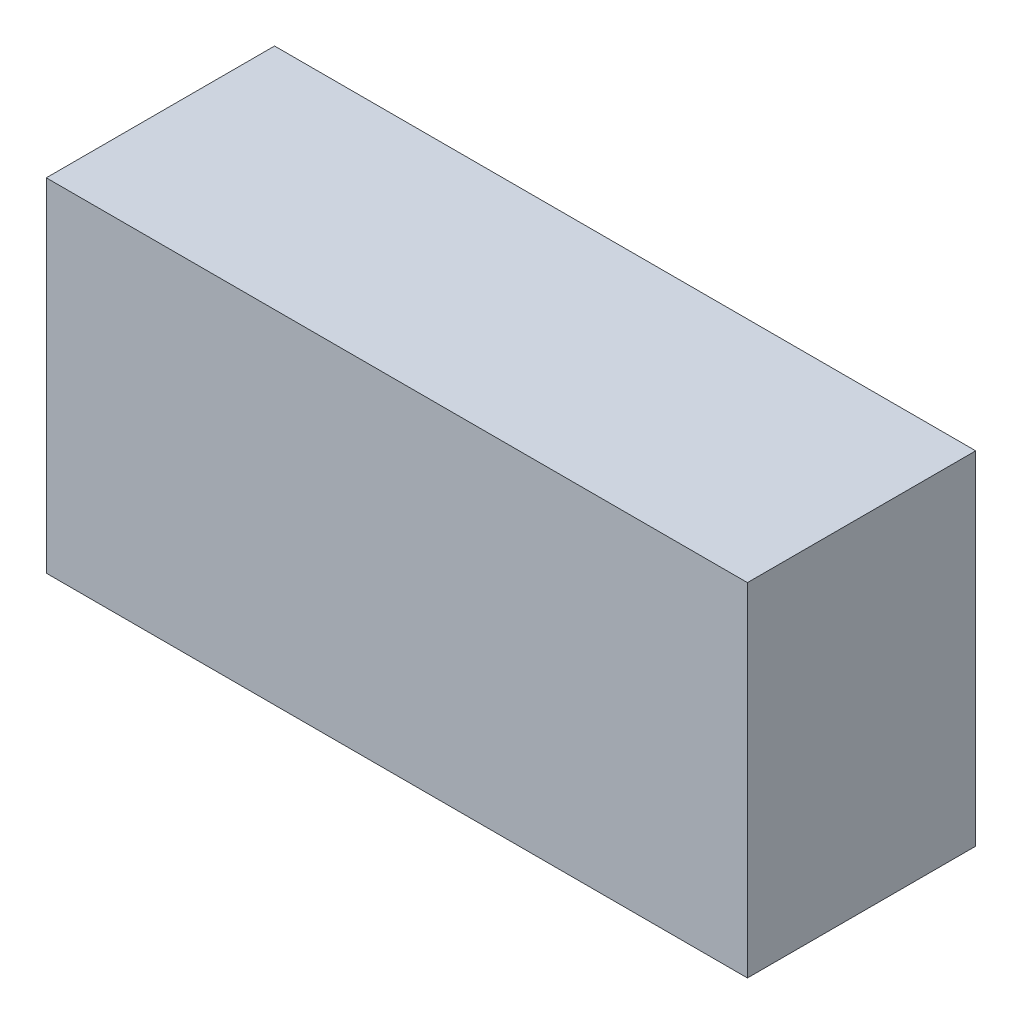
ISO-10303-21;
HEADER;
FILE_DESCRIPTION(('STEP AP214'),'2;1');
FILE_NAME('part.step','',(''),(''),'','','');
FILE_SCHEMA(('AUTOMOTIVE_DESIGN { 1 0 10303 214 1 1 1 1 }'));
ENDSEC;
DATA;
#1=APPLICATION_CONTEXT('core data for automotive mechanical design processes');
#2=APPLICATION_PROTOCOL_DEFINITION('international standard','automotive_design',2000,#1);
#3=PRODUCT_CONTEXT('',#1,'mechanical');
#4=PRODUCT('Part','Part','',(#3));
#5=PRODUCT_RELATED_PRODUCT_CATEGORY('part','',(#4));
#6=PRODUCT_DEFINITION_FORMATION('','',#4);
#7=PRODUCT_DEFINITION_CONTEXT('part definition',#1,'design');
#8=PRODUCT_DEFINITION('design','',#6,#7);
#9=PRODUCT_DEFINITION_SHAPE('','',#8);
#10=(LENGTH_UNIT() NAMED_UNIT(*) SI_UNIT(.MILLI.,.METRE.));
#11=(NAMED_UNIT(*) PLANE_ANGLE_UNIT() SI_UNIT($,.RADIAN.));
#12=(NAMED_UNIT(*) SI_UNIT($,.STERADIAN.) SOLID_ANGLE_UNIT());
#13=UNCERTAINTY_MEASURE_WITH_UNIT(LENGTH_MEASURE(1.E-05),#10,'distance_accuracy_value','');
#14=(GEOMETRIC_REPRESENTATION_CONTEXT(3) GLOBAL_UNCERTAINTY_ASSIGNED_CONTEXT((#13)) GLOBAL_UNIT_ASSIGNED_CONTEXT((#10,
#11,#12)) REPRESENTATION_CONTEXT('',''));
#15=CARTESIAN_POINT('',(0.,0.,0.));
#16=DIRECTION('',(0.,0.,1.));
#17=DIRECTION('',(1.,0.,0.));
#18=AXIS2_PLACEMENT_3D('',#15,#16,#17);
#19=CARTESIAN_POINT('',(-21.5,21.,14.));
#20=DIRECTION('',(1.,0.,0.));
#21=DIRECTION('',(0.,1.,0.));
#22=AXIS2_PLACEMENT_3D('',#19,#20,#21);
#23=PLANE('',#22);
#24=DIRECTION('',(0.,-1.,0.));
#25=VECTOR('',#24,1.);
#26=CARTESIAN_POINT('',(-21.5,21.,0.));
#27=LINE('',#26,#25);
#28=CARTESIAN_POINT('',(-21.5,21.,0.));
#29=VERTEX_POINT('',#28);
#30=CARTESIAN_POINT('',(-21.5,0.,0.));
#31=VERTEX_POINT('',#30);
#32=EDGE_CURVE('E96',#29,#31,#27,.T.);
#33=ORIENTED_EDGE('',*,*,#32,.T.);
#34=DIRECTION('',(0.,0.,-1.));
#35=VECTOR('',#34,1.);
#36=CARTESIAN_POINT('',(-21.5,0.,14.));
#37=LINE('',#36,#35);
#38=CARTESIAN_POINT('',(-21.5,0.,14.));
#39=VERTEX_POINT('',#38);
#40=EDGE_CURVE('E11',#39,#31,#37,.T.);
#41=ORIENTED_EDGE('',*,*,#40,.F.);
#42=DIRECTION('',(0.,-1.,0.));
#43=VECTOR('',#42,1.);
#44=CARTESIAN_POINT('',(-21.5,21.,14.));
#45=LINE('',#44,#43);
#46=CARTESIAN_POINT('',(-21.5,21.,14.));
#47=VERTEX_POINT('',#46);
#48=EDGE_CURVE('E84',#47,#39,#45,.T.);
#49=ORIENTED_EDGE('',*,*,#48,.F.);
#50=DIRECTION('',(0.,0.,-1.));
#51=VECTOR('',#50,1.);
#52=CARTESIAN_POINT('',(-21.5,21.,14.));
#53=LINE('',#52,#51);
#54=EDGE_CURVE('E92',#47,#29,#53,.T.);
#55=ORIENTED_EDGE('',*,*,#54,.T.);
#56=EDGE_LOOP('',(#33,#41,#49,#55));
#57=FACE_BOUND('',#56,.T.);
#58=ADVANCED_FACE('F33',(#57),#23,.F.);
#59=CARTESIAN_POINT('',(-21.5,0.,14.));
#60=DIRECTION('',(0.,1.,0.));
#61=DIRECTION('',(0.,0.,1.));
#62=AXIS2_PLACEMENT_3D('',#59,#60,#61);
#63=PLANE('',#62);
#64=DIRECTION('',(1.,0.,0.));
#65=VECTOR('',#64,1.);
#66=CARTESIAN_POINT('',(-21.5,0.,0.));
#67=LINE('',#66,#65);
#68=CARTESIAN_POINT('',(21.5,0.,0.));
#69=VERTEX_POINT('',#68);
#70=EDGE_CURVE('E88',#31,#69,#67,.T.);
#71=ORIENTED_EDGE('',*,*,#70,.T.);
#72=DIRECTION('',(0.,0.,-1.));
#73=VECTOR('',#72,1.);
#74=CARTESIAN_POINT('',(21.5,0.,14.));
#75=LINE('',#74,#73);
#76=CARTESIAN_POINT('',(21.5,0.,14.));
#77=VERTEX_POINT('',#76);
#78=EDGE_CURVE('E41',#77,#69,#75,.T.);
#79=ORIENTED_EDGE('',*,*,#78,.F.);
#80=DIRECTION('',(1.,0.,0.));
#81=VECTOR('',#80,1.);
#82=CARTESIAN_POINT('',(-21.5,0.,14.));
#83=LINE('',#82,#81);
#84=EDGE_CURVE('E79',#39,#77,#83,.T.);
#85=ORIENTED_EDGE('',*,*,#84,.F.);
#86=ORIENTED_EDGE('',*,*,#40,.T.);
#87=EDGE_LOOP('',(#71,#79,#85,#86));
#88=FACE_BOUND('',#87,.T.);
#89=ADVANCED_FACE('F87',(#88),#63,.F.);
#90=CARTESIAN_POINT('',(21.5,21.,14.));
#91=DIRECTION('',(-1.,0.,0.));
#92=DIRECTION('',(0.,-1.,0.));
#93=AXIS2_PLACEMENT_3D('',#90,#91,#92);
#94=PLANE('',#93);
#95=DIRECTION('',(0.,1.,0.));
#96=VECTOR('',#95,1.);
#97=CARTESIAN_POINT('',(21.5,21.,0.));
#98=LINE('',#97,#96);
#99=CARTESIAN_POINT('',(21.5,21.,0.));
#100=VERTEX_POINT('',#99);
#101=EDGE_CURVE('E66',#69,#100,#98,.T.);
#102=ORIENTED_EDGE('',*,*,#101,.T.);
#103=DIRECTION('',(0.,0.,-1.));
#104=VECTOR('',#103,1.);
#105=CARTESIAN_POINT('',(21.5,21.,14.));
#106=LINE('',#105,#104);
#107=CARTESIAN_POINT('',(21.5,21.,14.));
#108=VERTEX_POINT('',#107);
#109=EDGE_CURVE('E89',#108,#100,#106,.T.);
#110=ORIENTED_EDGE('',*,*,#109,.F.);
#111=DIRECTION('',(0.,1.,0.));
#112=VECTOR('',#111,1.);
#113=CARTESIAN_POINT('',(21.5,21.,14.));
#114=LINE('',#113,#112);
#115=EDGE_CURVE('E82',#77,#108,#114,.T.);
#116=ORIENTED_EDGE('',*,*,#115,.F.);
#117=ORIENTED_EDGE('',*,*,#78,.T.);
#118=EDGE_LOOP('',(#102,#110,#116,#117));
#119=FACE_BOUND('',#118,.T.);
#120=ADVANCED_FACE('F90',(#119),#94,.F.);
#121=CARTESIAN_POINT('',(-21.5,21.,14.));
#122=DIRECTION('',(0.,-1.,0.));
#123=DIRECTION('',(1.,0.,0.));
#124=AXIS2_PLACEMENT_3D('',#121,#122,#123);
#125=PLANE('',#124);
#126=DIRECTION('',(-1.,0.,0.));
#127=VECTOR('',#126,1.);
#128=CARTESIAN_POINT('',(-21.5,21.,0.));
#129=LINE('',#128,#127);
#130=EDGE_CURVE('E72',#100,#29,#129,.T.);
#131=ORIENTED_EDGE('',*,*,#130,.T.);
#132=ORIENTED_EDGE('',*,*,#54,.F.);
#133=DIRECTION('',(-1.,0.,0.));
#134=VECTOR('',#133,1.);
#135=CARTESIAN_POINT('',(-21.5,21.,14.));
#136=LINE('',#135,#134);
#137=EDGE_CURVE('E49',#108,#47,#136,.T.);
#138=ORIENTED_EDGE('',*,*,#137,.F.);
#139=ORIENTED_EDGE('',*,*,#109,.T.);
#140=EDGE_LOOP('',(#131,#132,#138,#139));
#141=FACE_BOUND('',#140,.T.);
#142=ADVANCED_FACE('F103',(#141),#125,.F.);
#143=CARTESIAN_POINT('',(0.,0.,14.));
#144=DIRECTION('',(0.,0.,1.));
#145=DIRECTION('',(1.,0.,0.));
#146=AXIS2_PLACEMENT_3D('',#143,#144,#145);
#147=PLANE('',#146);
#148=ORIENTED_EDGE('',*,*,#48,.T.);
#149=ORIENTED_EDGE('',*,*,#84,.T.);
#150=ORIENTED_EDGE('',*,*,#115,.T.);
#151=ORIENTED_EDGE('',*,*,#137,.T.);
#152=EDGE_LOOP('',(#148,#149,#150,#151));
#153=FACE_BOUND('',#152,.T.);
#154=ADVANCED_FACE('F80',(#153),#147,.T.);
#155=CARTESIAN_POINT('',(0.,0.,0.));
#156=DIRECTION('',(0.,0.,1.));
#157=DIRECTION('',(1.,0.,0.));
#158=AXIS2_PLACEMENT_3D('',#155,#156,#157);
#159=PLANE('',#158);
#160=ORIENTED_EDGE('',*,*,#32,.F.);
#161=ORIENTED_EDGE('',*,*,#130,.F.);
#162=ORIENTED_EDGE('',*,*,#101,.F.);
#163=ORIENTED_EDGE('',*,*,#70,.F.);
#164=EDGE_LOOP('',(#160,#161,#162,#163));
#165=FACE_BOUND('',#164,.T.);
#166=ADVANCED_FACE('F106',(#165),#159,.F.);
#167=CLOSED_SHELL('',(#58,#89,#120,#142,#154,#166));
#168=MANIFOLD_SOLID_BREP('B2',#167);
#169=ADVANCED_BREP_SHAPE_REPRESENTATION('',(#18,#168),#14);
#170=SHAPE_DEFINITION_REPRESENTATION(#9,#169);
ENDSEC;
END-ISO-10303-21;
